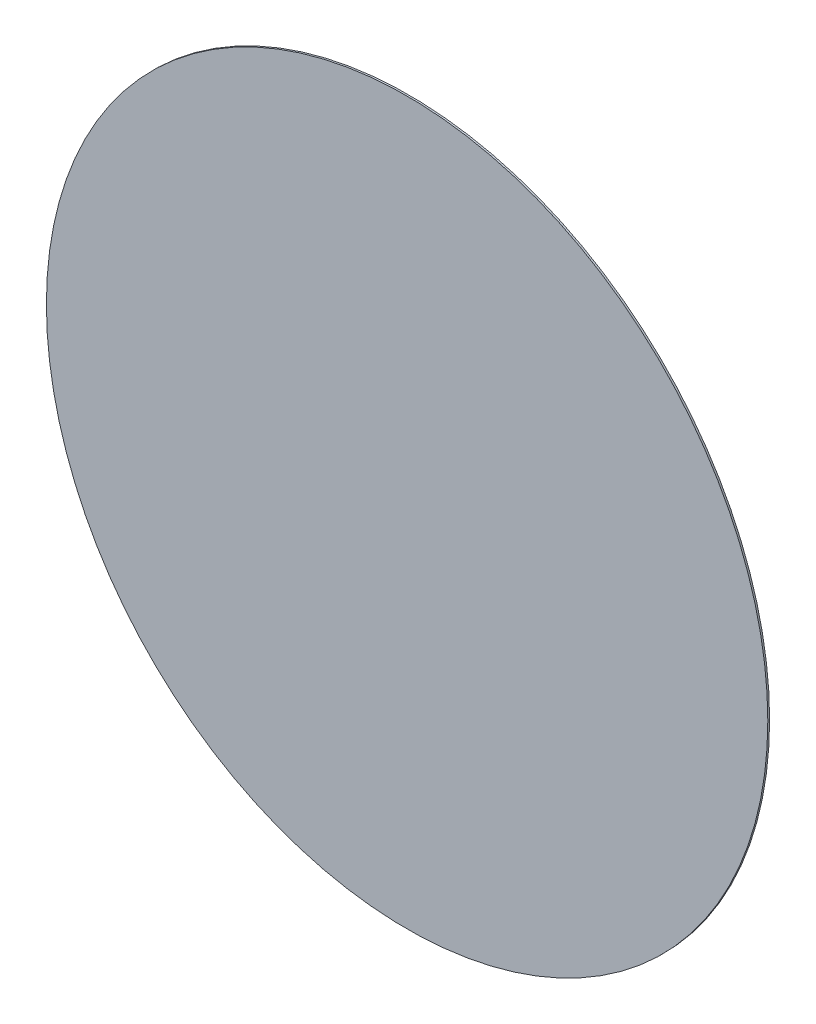
ISO-10303-21;
HEADER;
FILE_DESCRIPTION(('STEP AP214'),'2;1');
FILE_NAME('part.step','',(''),(''),'','','');
FILE_SCHEMA(('AUTOMOTIVE_DESIGN { 1 0 10303 214 1 1 1 1 }'));
ENDSEC;
DATA;
#1=APPLICATION_CONTEXT('core data for automotive mechanical design processes');
#2=APPLICATION_PROTOCOL_DEFINITION('international standard','automotive_design',2000,#1);
#3=PRODUCT_CONTEXT('',#1,'mechanical');
#4=PRODUCT('Part','Part','',(#3));
#5=PRODUCT_RELATED_PRODUCT_CATEGORY('part','',(#4));
#6=PRODUCT_DEFINITION_FORMATION('','',#4);
#7=PRODUCT_DEFINITION_CONTEXT('part definition',#1,'design');
#8=PRODUCT_DEFINITION('design','',#6,#7);
#9=PRODUCT_DEFINITION_SHAPE('','',#8);
#10=(LENGTH_UNIT() NAMED_UNIT(*) SI_UNIT(.MILLI.,.METRE.));
#11=(NAMED_UNIT(*) PLANE_ANGLE_UNIT() SI_UNIT($,.RADIAN.));
#12=(NAMED_UNIT(*) SI_UNIT($,.STERADIAN.) SOLID_ANGLE_UNIT());
#13=UNCERTAINTY_MEASURE_WITH_UNIT(LENGTH_MEASURE(1.E-05),#10,'distance_accuracy_value','');
#14=(GEOMETRIC_REPRESENTATION_CONTEXT(3) GLOBAL_UNCERTAINTY_ASSIGNED_CONTEXT((#13)) GLOBAL_UNIT_ASSIGNED_CONTEXT((#10,
#11,#12)) REPRESENTATION_CONTEXT('',''));
#15=CARTESIAN_POINT('',(0.,0.,0.));
#16=DIRECTION('',(0.,0.,1.));
#17=DIRECTION('',(1.,0.,0.));
#18=AXIS2_PLACEMENT_3D('',#15,#16,#17);
#19=CARTESIAN_POINT('',(0.,0.,1.));
#20=DIRECTION('',(0.,0.,-1.));
#21=DIRECTION('',(-1.,0.,0.));
#22=AXIS2_PLACEMENT_3D('',#19,#20,#21);
#23=CYLINDRICAL_SURFACE('',#22,200.);
#24=CARTESIAN_POINT('',(0.,0.,1.));
#25=DIRECTION('',(0.,0.,1.));
#26=DIRECTION('',(1.,0.,0.));
#27=AXIS2_PLACEMENT_3D('',#24,#25,#26);
#28=CIRCLE('',#27,200.);
#29=CARTESIAN_POINT('',(200.,0.,1.));
#30=VERTEX_POINT('',#29);
#31=EDGE_CURVE('E10',#30,#30,#28,.T.);
#32=ORIENTED_EDGE('',*,*,#31,.F.);
#33=EDGE_LOOP('',(#32));
#34=FACE_BOUND('',#33,.T.);
#35=CARTESIAN_POINT('',(0.,0.,0.));
#36=DIRECTION('',(0.,0.,1.));
#37=DIRECTION('',(1.,0.,0.));
#38=AXIS2_PLACEMENT_3D('',#35,#36,#37);
#39=CIRCLE('',#38,200.);
#40=CARTESIAN_POINT('',(200.,0.,0.));
#41=VERTEX_POINT('',#40);
#42=EDGE_CURVE('E35',#41,#41,#39,.T.);
#43=ORIENTED_EDGE('',*,*,#42,.T.);
#44=EDGE_LOOP('',(#43));
#45=FACE_BOUND('',#44,.T.);
#46=ADVANCED_FACE('F32',(#34,#45),#23,.T.);
#47=CARTESIAN_POINT('',(0.,0.,1.));
#48=DIRECTION('',(0.,0.,1.));
#49=DIRECTION('',(1.,0.,0.));
#50=AXIS2_PLACEMENT_3D('',#47,#48,#49);
#51=PLANE('',#50);
#52=ORIENTED_EDGE('',*,*,#31,.T.);
#53=EDGE_LOOP('',(#52));
#54=FACE_BOUND('',#53,.T.);
#55=ADVANCED_FACE('F47',(#54),#51,.T.);
#56=CARTESIAN_POINT('',(0.,0.,0.));
#57=DIRECTION('',(0.,0.,1.));
#58=DIRECTION('',(1.,0.,0.));
#59=AXIS2_PLACEMENT_3D('',#56,#57,#58);
#60=PLANE('',#59);
#61=ORIENTED_EDGE('',*,*,#42,.F.);
#62=EDGE_LOOP('',(#61));
#63=FACE_BOUND('',#62,.T.);
#64=ADVANCED_FACE('F45',(#63),#60,.F.);
#65=CLOSED_SHELL('',(#46,#55,#64));
#66=MANIFOLD_SOLID_BREP('B2',#65);
#67=ADVANCED_BREP_SHAPE_REPRESENTATION('',(#18,#66),#14);
#68=SHAPE_DEFINITION_REPRESENTATION(#9,#67);
ENDSEC;
END-ISO-10303-21;
